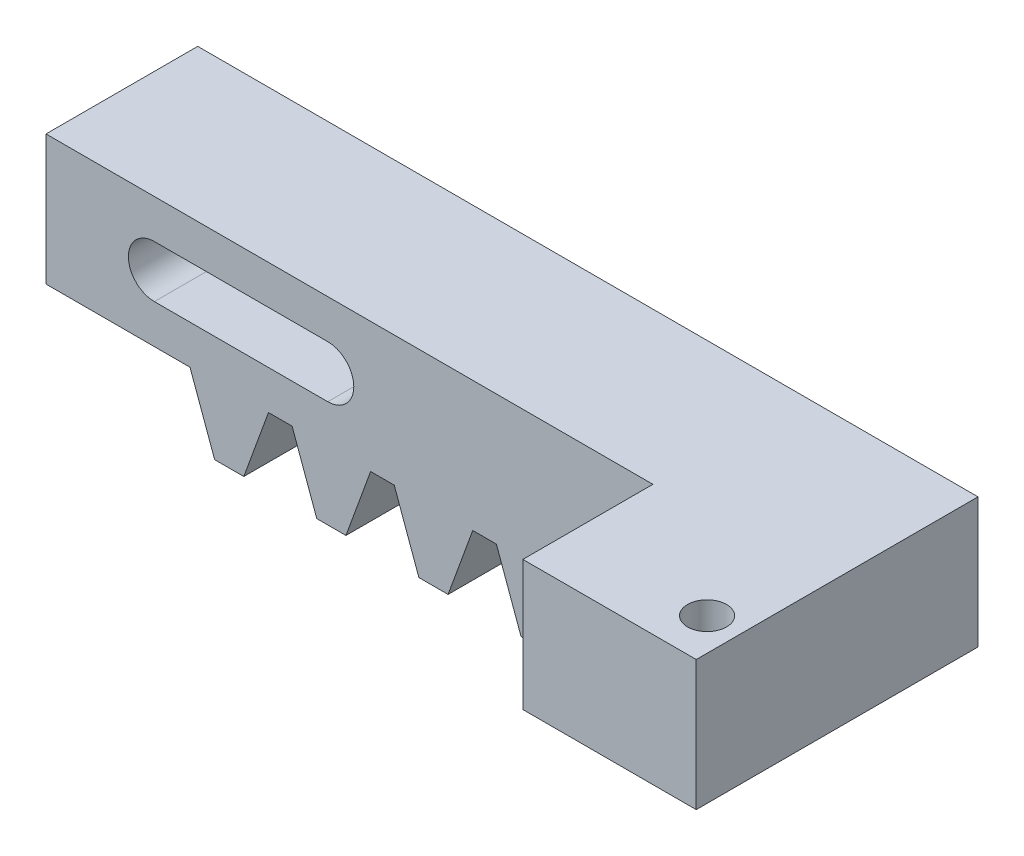
ISO-10303-21;
HEADER;
FILE_DESCRIPTION(('STEP AP214'),'2;1');
FILE_NAME('part.step','',(''),(''),'','','');
FILE_SCHEMA(('AUTOMOTIVE_DESIGN { 1 0 10303 214 1 1 1 1 }'));
ENDSEC;
DATA;
#1=APPLICATION_CONTEXT('core data for automotive mechanical design processes');
#2=APPLICATION_PROTOCOL_DEFINITION('international standard','automotive_design',2000,#1);
#3=PRODUCT_CONTEXT('',#1,'mechanical');
#4=PRODUCT('Part','Part','',(#3));
#5=PRODUCT_RELATED_PRODUCT_CATEGORY('part','',(#4));
#6=PRODUCT_DEFINITION_FORMATION('','',#4);
#7=PRODUCT_DEFINITION_CONTEXT('part definition',#1,'design');
#8=PRODUCT_DEFINITION('design','',#6,#7);
#9=PRODUCT_DEFINITION_SHAPE('','',#8);
#10=(LENGTH_UNIT() NAMED_UNIT(*) SI_UNIT(.MILLI.,.METRE.));
#11=(NAMED_UNIT(*) PLANE_ANGLE_UNIT() SI_UNIT($,.RADIAN.));
#12=(NAMED_UNIT(*) SI_UNIT($,.STERADIAN.) SOLID_ANGLE_UNIT());
#13=UNCERTAINTY_MEASURE_WITH_UNIT(LENGTH_MEASURE(1.E-05),#10,'distance_accuracy_value','');
#14=(GEOMETRIC_REPRESENTATION_CONTEXT(3) GLOBAL_UNCERTAINTY_ASSIGNED_CONTEXT((#13)) GLOBAL_UNIT_ASSIGNED_CONTEXT((#10,
#11,#12)) REPRESENTATION_CONTEXT('',''));
#15=CARTESIAN_POINT('',(0.,0.,0.));
#16=DIRECTION('',(0.,0.,1.));
#17=DIRECTION('',(1.,0.,0.));
#18=AXIS2_PLACEMENT_3D('',#15,#16,#17);
#19=CARTESIAN_POINT('',(0.,0.,20.5));
#20=DIRECTION('',(0.,0.,-1.));
#21=DIRECTION('',(-1.,0.,0.));
#22=AXIS2_PLACEMENT_3D('',#19,#20,#21);
#23=PLANE('',#22);
#24=CARTESIAN_POINT('',(-11.7,16.975,20.5));
#25=DIRECTION('',(0.,0.,-1.));
#26=DIRECTION('',(-1.,0.,0.));
#27=AXIS2_PLACEMENT_3D('',#24,#25,#26);
#28=CIRCLE('',#27,1.2);
#29=CARTESIAN_POINT('',(-11.7,18.175,20.5));
#30=VERTEX_POINT('',#29);
#31=CARTESIAN_POINT('',(-11.7,15.775,20.5));
#32=VERTEX_POINT('',#31);
#33=EDGE_CURVE('E507',#30,#32,#28,.F.);
#34=ORIENTED_EDGE('',*,*,#33,.F.);
#35=DIRECTION('',(-1.,0.,0.));
#36=VECTOR('',#35,1.);
#37=CARTESIAN_POINT('',(0.,18.175,20.5));
#38=LINE('',#37,#36);
#39=CARTESIAN_POINT('',(-3.7,18.175,20.5));
#40=VERTEX_POINT('',#39);
#41=EDGE_CURVE('E505',#40,#30,#38,.T.);
#42=ORIENTED_EDGE('',*,*,#41,.F.);
#43=CARTESIAN_POINT('',(-3.7,16.975,20.5));
#44=DIRECTION('',(0.,0.,-1.));
#45=DIRECTION('',(-1.,0.,0.));
#46=AXIS2_PLACEMENT_3D('',#43,#44,#45);
#47=CIRCLE('',#46,1.2);
#48=CARTESIAN_POINT('',(-3.7,15.775,20.5));
#49=VERTEX_POINT('',#48);
#50=EDGE_CURVE('E53',#49,#40,#47,.F.);
#51=ORIENTED_EDGE('',*,*,#50,.F.);
#52=DIRECTION('',(1.,0.,0.));
#53=VECTOR('',#52,1.);
#54=CARTESIAN_POINT('',(0.,15.775,20.5));
#55=LINE('',#54,#53);
#56=EDGE_CURVE('E497',#32,#49,#55,.T.);
#57=ORIENTED_EDGE('',*,*,#56,.F.);
#58=EDGE_LOOP('',(#34,#42,#51,#57));
#59=FACE_BOUND('',#58,.T.);
#60=DIRECTION('',(0.,-1.,0.));
#61=VECTOR('',#60,1.);
#62=CARTESIAN_POINT('',(11.3,19.975,20.5));
#63=LINE('',#62,#61);
#64=CARTESIAN_POINT('',(11.3,19.975,20.5));
#65=VERTEX_POINT('',#64);
#66=CARTESIAN_POINT('',(11.3,13.975,20.5));
#67=VERTEX_POINT('',#66);
#68=EDGE_CURVE('E481',#65,#67,#63,.T.);
#69=ORIENTED_EDGE('',*,*,#68,.F.);
#70=DIRECTION('',(-1.,0.,0.));
#71=VECTOR('',#70,1.);
#72=CARTESIAN_POINT('',(-16.7,19.975,20.5));
#73=LINE('',#72,#71);
#74=CARTESIAN_POINT('',(-16.7,19.975,20.5));
#75=VERTEX_POINT('',#74);
#76=EDGE_CURVE('E364',#65,#75,#73,.T.);
#77=ORIENTED_EDGE('',*,*,#76,.T.);
#78=DIRECTION('',(0.,-1.,0.));
#79=VECTOR('',#78,1.);
#80=CARTESIAN_POINT('',(-16.7,13.975,20.5));
#81=LINE('',#80,#79);
#82=CARTESIAN_POINT('',(-16.7,13.975,20.5));
#83=VERTEX_POINT('',#82);
#84=EDGE_CURVE('E370',#75,#83,#81,.T.);
#85=ORIENTED_EDGE('',*,*,#84,.T.);
#86=DIRECTION('',(1.,0.,0.));
#87=VECTOR('',#86,1.);
#88=CARTESIAN_POINT('',(-10.0572221500185,13.975,20.5));
#89=LINE('',#88,#87);
#90=CARTESIAN_POINT('',(-10.0572221500185,13.975,20.5));
#91=VERTEX_POINT('',#90);
#92=EDGE_CURVE('E469',#83,#91,#89,.T.);
#93=ORIENTED_EDGE('',*,*,#92,.T.);
#94=DIRECTION('',(0.342020143325669,-0.939692620785908,0.));
#95=VECTOR('',#94,1.);
#96=CARTESIAN_POINT('',(-8.91981516793663,10.85,20.5));
#97=LINE('',#96,#95);
#98=CARTESIAN_POINT('',(-8.91981516793663,10.85,20.5));
#99=VERTEX_POINT('',#98);
#100=EDGE_CURVE('E470',#91,#99,#97,.T.);
#101=ORIENTED_EDGE('',*,*,#100,.T.);
#102=DIRECTION('',(1.,0.,0.));
#103=VECTOR('',#102,1.);
#104=CARTESIAN_POINT('',(-7.57354626340979,10.85,20.5));
#105=LINE('',#104,#103);
#106=CARTESIAN_POINT('',(-7.57354626340979,10.85,20.5));
#107=VERTEX_POINT('',#106);
#108=EDGE_CURVE('E464',#99,#107,#105,.T.);
#109=ORIENTED_EDGE('',*,*,#108,.T.);
#110=DIRECTION('',(0.342020143325669,0.939692620785909,0.));
#111=VECTOR('',#110,1.);
#112=CARTESIAN_POINT('',(-6.43613928132791,13.975,20.5));
#113=LINE('',#112,#111);
#114=CARTESIAN_POINT('',(-6.43613928132791,13.975,20.5));
#115=VERTEX_POINT('',#114);
#116=EDGE_CURVE('E462',#107,#115,#113,.T.);
#117=ORIENTED_EDGE('',*,*,#116,.T.);
#118=DIRECTION('',(1.,0.,0.));
#119=VECTOR('',#118,1.);
#120=CARTESIAN_POINT('',(-5.34483316963382,13.975,20.5));
#121=LINE('',#120,#119);
#122=CARTESIAN_POINT('',(-5.34483316963382,13.975,20.5));
#123=VERTEX_POINT('',#122);
#124=EDGE_CURVE('E461',#115,#123,#121,.T.);
#125=ORIENTED_EDGE('',*,*,#124,.T.);
#126=DIRECTION('',(0.342020143325669,-0.939692620785909,0.));
#127=VECTOR('',#126,1.);
#128=CARTESIAN_POINT('',(-4.20742618755194,10.85,20.5));
#129=LINE('',#128,#127);
#130=CARTESIAN_POINT('',(-4.20742618755194,10.85,20.5));
#131=VERTEX_POINT('',#130);
#132=EDGE_CURVE('E460',#123,#131,#129,.T.);
#133=ORIENTED_EDGE('',*,*,#132,.T.);
#134=DIRECTION('',(1.,0.,0.));
#135=VECTOR('',#134,1.);
#136=CARTESIAN_POINT('',(-2.8611572830251,10.85,20.5));
#137=LINE('',#136,#135);
#138=CARTESIAN_POINT('',(-2.8611572830251,10.85,20.5));
#139=VERTEX_POINT('',#138);
#140=EDGE_CURVE('E459',#131,#139,#137,.T.);
#141=ORIENTED_EDGE('',*,*,#140,.T.);
#142=DIRECTION('',(0.342020143325669,0.939692620785909,0.));
#143=VECTOR('',#142,1.);
#144=CARTESIAN_POINT('',(-1.72375030094322,13.975,20.5));
#145=LINE('',#144,#143);
#146=CARTESIAN_POINT('',(-1.72375030094322,13.975,20.5));
#147=VERTEX_POINT('',#146);
#148=EDGE_CURVE('E455',#139,#147,#145,.T.);
#149=ORIENTED_EDGE('',*,*,#148,.T.);
#150=DIRECTION('',(1.,0.,0.));
#151=VECTOR('',#150,1.);
#152=CARTESIAN_POINT('',(-0.632444189249129,13.975,20.5));
#153=LINE('',#152,#151);
#154=CARTESIAN_POINT('',(-0.632444189249129,13.975,20.5));
#155=VERTEX_POINT('',#154);
#156=EDGE_CURVE('E454',#147,#155,#153,.T.);
#157=ORIENTED_EDGE('',*,*,#156,.T.);
#158=DIRECTION('',(0.342020143325669,-0.939692620785909,0.));
#159=VECTOR('',#158,1.);
#160=CARTESIAN_POINT('',(0.504962792832753,10.85,20.5));
#161=LINE('',#160,#159);
#162=CARTESIAN_POINT('',(0.504962792832753,10.85,20.5));
#163=VERTEX_POINT('',#162);
#164=EDGE_CURVE('E451',#155,#163,#161,.T.);
#165=ORIENTED_EDGE('',*,*,#164,.T.);
#166=DIRECTION('',(1.,0.,0.));
#167=VECTOR('',#166,1.);
#168=CARTESIAN_POINT('',(1.85123169735959,10.85,20.5));
#169=LINE('',#168,#167);
#170=CARTESIAN_POINT('',(1.85123169735959,10.85,20.5));
#171=VERTEX_POINT('',#170);
#172=EDGE_CURVE('E446',#163,#171,#169,.T.);
#173=ORIENTED_EDGE('',*,*,#172,.T.);
#174=DIRECTION('',(0.342020143325669,0.939692620785909,0.));
#175=VECTOR('',#174,1.);
#176=CARTESIAN_POINT('',(2.98863867944147,13.975,20.5));
#177=LINE('',#176,#175);
#178=CARTESIAN_POINT('',(2.98863867944147,13.975,20.5));
#179=VERTEX_POINT('',#178);
#180=EDGE_CURVE('E450',#171,#179,#177,.T.);
#181=ORIENTED_EDGE('',*,*,#180,.T.);
#182=DIRECTION('',(1.,0.,0.));
#183=VECTOR('',#182,1.);
#184=CARTESIAN_POINT('',(4.07994479113556,13.975,20.5));
#185=LINE('',#184,#183);
#186=CARTESIAN_POINT('',(4.07994479113556,13.975,20.5));
#187=VERTEX_POINT('',#186);
#188=EDGE_CURVE('E444',#179,#187,#185,.T.);
#189=ORIENTED_EDGE('',*,*,#188,.T.);
#190=DIRECTION('',(0.342020143325669,-0.939692620785909,0.));
#191=VECTOR('',#190,1.);
#192=CARTESIAN_POINT('',(5.21735177321744,10.85,20.5));
#193=LINE('',#192,#191);
#194=CARTESIAN_POINT('',(5.21735177321744,10.85,20.5));
#195=VERTEX_POINT('',#194);
#196=EDGE_CURVE('E442',#187,#195,#193,.T.);
#197=ORIENTED_EDGE('',*,*,#196,.T.);
#198=DIRECTION('',(1.,0.,0.));
#199=VECTOR('',#198,1.);
#200=CARTESIAN_POINT('',(6.56362067774428,10.85,20.5));
#201=LINE('',#200,#199);
#202=CARTESIAN_POINT('',(6.56362067774428,10.85,20.5));
#203=VERTEX_POINT('',#202);
#204=EDGE_CURVE('E441',#195,#203,#201,.T.);
#205=ORIENTED_EDGE('',*,*,#204,.T.);
#206=DIRECTION('',(0.342020143325669,0.939692620785909,0.));
#207=VECTOR('',#206,1.);
#208=CARTESIAN_POINT('',(7.70102765982616,13.975,20.5));
#209=LINE('',#208,#207);
#210=CARTESIAN_POINT('',(7.70102765982616,13.975,20.5));
#211=VERTEX_POINT('',#210);
#212=EDGE_CURVE('E437',#203,#211,#209,.T.);
#213=ORIENTED_EDGE('',*,*,#212,.T.);
#214=DIRECTION('',(1.,0.,0.));
#215=VECTOR('',#214,1.);
#216=CARTESIAN_POINT('',(8.79233377152025,13.975,20.5));
#217=LINE('',#216,#215);
#218=CARTESIAN_POINT('',(8.79233377152025,13.975,20.5));
#219=VERTEX_POINT('',#218);
#220=EDGE_CURVE('E440',#211,#219,#217,.T.);
#221=ORIENTED_EDGE('',*,*,#220,.T.);
#222=DIRECTION('',(0.342020143325669,-0.939692620785908,0.));
#223=VECTOR('',#222,1.);
#224=CARTESIAN_POINT('',(9.92974075360213,10.85,20.5));
#225=LINE('',#224,#223);
#226=CARTESIAN_POINT('',(9.92974075360213,10.85,20.5));
#227=VERTEX_POINT('',#226);
#228=EDGE_CURVE('E434',#219,#227,#225,.T.);
#229=ORIENTED_EDGE('',*,*,#228,.T.);
#230=DIRECTION('',(1.,0.,0.));
#231=VECTOR('',#230,1.);
#232=CARTESIAN_POINT('',(11.276009658129,10.85,20.5));
#233=LINE('',#232,#231);
#234=CARTESIAN_POINT('',(11.276009658129,10.85,20.5));
#235=VERTEX_POINT('',#234);
#236=EDGE_CURVE('E433',#227,#235,#233,.T.);
#237=ORIENTED_EDGE('',*,*,#236,.T.);
#238=DIRECTION('',(0.342020143325669,0.939692620785908,0.));
#239=VECTOR('',#238,1.);
#240=CARTESIAN_POINT('',(12.4134166402109,13.975,20.5));
#241=LINE('',#240,#239);
#242=CARTESIAN_POINT('',(12.4134166402109,13.975,20.5));
#243=VERTEX_POINT('',#242);
#244=EDGE_CURVE('E431',#235,#243,#241,.T.);
#245=ORIENTED_EDGE('',*,*,#244,.T.);
#246=DIRECTION('',(1.,0.,0.));
#247=VECTOR('',#246,1.);
#248=CARTESIAN_POINT('',(11.3,13.975,20.5));
#249=LINE('',#248,#247);
#250=EDGE_CURVE('E278',#67,#243,#249,.T.);
#251=ORIENTED_EDGE('',*,*,#250,.F.);
#252=EDGE_LOOP('',(#69,#77,#85,#93,#101,#109,#117,#125,#133,#141,#149,#157,#165,#173,#181,#189,
#197,#205,#213,#221,#229,#237,#245,#251));
#253=FACE_BOUND('',#252,.T.);
#254=ADVANCED_FACE('F39',(#59,#253),#23,.F.);
#255=CARTESIAN_POINT('',(0.,0.,13.5));
#256=DIRECTION('',(0.,0.,-1.));
#257=DIRECTION('',(-1.,0.,0.));
#258=AXIS2_PLACEMENT_3D('',#255,#256,#257);
#259=PLANE('',#258);
#260=DIRECTION('',(0.,-1.,0.));
#261=VECTOR('',#260,1.);
#262=CARTESIAN_POINT('',(-16.7,13.975,13.5));
#263=LINE('',#262,#261);
#264=CARTESIAN_POINT('',(-16.7,19.975,13.5));
#265=VERTEX_POINT('',#264);
#266=CARTESIAN_POINT('',(-16.7,13.975,13.5));
#267=VERTEX_POINT('',#266);
#268=EDGE_CURVE('E419',#265,#267,#263,.T.);
#269=ORIENTED_EDGE('',*,*,#268,.F.);
#270=DIRECTION('',(-1.,0.,0.));
#271=VECTOR('',#270,1.);
#272=CARTESIAN_POINT('',(-16.7,19.975,13.5));
#273=LINE('',#272,#271);
#274=CARTESIAN_POINT('',(19.3,19.975,13.5));
#275=VERTEX_POINT('',#274);
#276=EDGE_CURVE('E362',#275,#265,#273,.T.);
#277=ORIENTED_EDGE('',*,*,#276,.F.);
#278=DIRECTION('',(0.,1.,0.));
#279=VECTOR('',#278,1.);
#280=CARTESIAN_POINT('',(19.3,19.975,13.5));
#281=LINE('',#280,#279);
#282=CARTESIAN_POINT('',(19.3,13.975,13.5));
#283=VERTEX_POINT('',#282);
#284=EDGE_CURVE('E368',#283,#275,#281,.T.);
#285=ORIENTED_EDGE('',*,*,#284,.F.);
#286=DIRECTION('',(1.,0.,0.));
#287=VECTOR('',#286,1.);
#288=CARTESIAN_POINT('',(19.3,13.975,13.5));
#289=LINE('',#288,#287);
#290=CARTESIAN_POINT('',(17.1258056205955,13.975,13.5));
#291=VERTEX_POINT('',#290);
#292=EDGE_CURVE('E369',#291,#283,#289,.T.);
#293=ORIENTED_EDGE('',*,*,#292,.F.);
#294=DIRECTION('',(0.34202014332567,0.939692620785908,0.));
#295=VECTOR('',#294,1.);
#296=CARTESIAN_POINT('',(17.1258056205955,13.975,13.5));
#297=LINE('',#296,#295);
#298=CARTESIAN_POINT('',(15.9883986385137,10.85,13.5));
#299=VERTEX_POINT('',#298);
#300=EDGE_CURVE('E375',#299,#291,#297,.T.);
#301=ORIENTED_EDGE('',*,*,#300,.F.);
#302=DIRECTION('',(1.,0.,0.));
#303=VECTOR('',#302,1.);
#304=CARTESIAN_POINT('',(15.9883986385137,10.85,13.5));
#305=LINE('',#304,#303);
#306=CARTESIAN_POINT('',(14.6421297339868,10.85,13.5));
#307=VERTEX_POINT('',#306);
#308=EDGE_CURVE('E372',#307,#299,#305,.T.);
#309=ORIENTED_EDGE('',*,*,#308,.F.);
#310=DIRECTION('',(0.342020143325669,-0.939692620785908,0.));
#311=VECTOR('',#310,1.);
#312=CARTESIAN_POINT('',(14.6421297339868,10.85,13.5));
#313=LINE('',#312,#311);
#314=CARTESIAN_POINT('',(13.5047227519049,13.975,13.5));
#315=VERTEX_POINT('',#314);
#316=EDGE_CURVE('E376',#315,#307,#313,.T.);
#317=ORIENTED_EDGE('',*,*,#316,.F.);
#318=DIRECTION('',(1.,0.,0.));
#319=VECTOR('',#318,1.);
#320=CARTESIAN_POINT('',(13.5047227519049,13.975,13.5));
#321=LINE('',#320,#319);
#322=CARTESIAN_POINT('',(12.4134166402109,13.975,13.5));
#323=VERTEX_POINT('',#322);
#324=EDGE_CURVE('E377',#323,#315,#321,.T.);
#325=ORIENTED_EDGE('',*,*,#324,.F.);
#326=DIRECTION('',(0.342020143325669,0.939692620785908,0.));
#327=VECTOR('',#326,1.);
#328=CARTESIAN_POINT('',(12.4134166402109,13.975,13.5));
#329=LINE('',#328,#327);
#330=CARTESIAN_POINT('',(11.276009658129,10.85,13.5));
#331=VERTEX_POINT('',#330);
#332=EDGE_CURVE('E379',#331,#323,#329,.T.);
#333=ORIENTED_EDGE('',*,*,#332,.F.);
#334=DIRECTION('',(1.,0.,0.));
#335=VECTOR('',#334,1.);
#336=CARTESIAN_POINT('',(11.276009658129,10.85,13.5));
#337=LINE('',#336,#335);
#338=CARTESIAN_POINT('',(9.92974075360213,10.85,13.5));
#339=VERTEX_POINT('',#338);
#340=EDGE_CURVE('E385',#339,#331,#337,.T.);
#341=ORIENTED_EDGE('',*,*,#340,.F.);
#342=DIRECTION('',(0.342020143325669,-0.939692620785908,0.));
#343=VECTOR('',#342,1.);
#344=CARTESIAN_POINT('',(9.92974075360213,10.85,13.5));
#345=LINE('',#344,#343);
#346=CARTESIAN_POINT('',(8.79233377152025,13.975,13.5));
#347=VERTEX_POINT('',#346);
#348=EDGE_CURVE('E381',#347,#339,#345,.T.);
#349=ORIENTED_EDGE('',*,*,#348,.F.);
#350=DIRECTION('',(1.,0.,0.));
#351=VECTOR('',#350,1.);
#352=CARTESIAN_POINT('',(8.79233377152025,13.975,13.5));
#353=LINE('',#352,#351);
#354=CARTESIAN_POINT('',(7.70102765982616,13.975,13.5));
#355=VERTEX_POINT('',#354);
#356=EDGE_CURVE('E386',#355,#347,#353,.T.);
#357=ORIENTED_EDGE('',*,*,#356,.F.);
#358=DIRECTION('',(0.342020143325669,0.939692620785909,0.));
#359=VECTOR('',#358,1.);
#360=CARTESIAN_POINT('',(7.70102765982616,13.975,13.5));
#361=LINE('',#360,#359);
#362=CARTESIAN_POINT('',(6.56362067774428,10.85,13.5));
#363=VERTEX_POINT('',#362);
#364=EDGE_CURVE('E389',#363,#355,#361,.T.);
#365=ORIENTED_EDGE('',*,*,#364,.F.);
#366=DIRECTION('',(1.,0.,0.));
#367=VECTOR('',#366,1.);
#368=CARTESIAN_POINT('',(6.56362067774428,10.85,13.5));
#369=LINE('',#368,#367);
#370=CARTESIAN_POINT('',(5.21735177321744,10.85,13.5));
#371=VERTEX_POINT('',#370);
#372=EDGE_CURVE('E390',#371,#363,#369,.T.);
#373=ORIENTED_EDGE('',*,*,#372,.F.);
#374=DIRECTION('',(0.342020143325669,-0.939692620785909,0.));
#375=VECTOR('',#374,1.);
#376=CARTESIAN_POINT('',(5.21735177321744,10.85,13.5));
#377=LINE('',#376,#375);
#378=CARTESIAN_POINT('',(4.07994479113556,13.975,13.5));
#379=VERTEX_POINT('',#378);
#380=EDGE_CURVE('E394',#379,#371,#377,.T.);
#381=ORIENTED_EDGE('',*,*,#380,.F.);
#382=DIRECTION('',(1.,0.,0.));
#383=VECTOR('',#382,1.);
#384=CARTESIAN_POINT('',(4.07994479113556,13.975,13.5));
#385=LINE('',#384,#383);
#386=CARTESIAN_POINT('',(2.98863867944147,13.975,13.5));
#387=VERTEX_POINT('',#386);
#388=EDGE_CURVE('E395',#387,#379,#385,.T.);
#389=ORIENTED_EDGE('',*,*,#388,.F.);
#390=DIRECTION('',(0.342020143325669,0.939692620785909,0.));
#391=VECTOR('',#390,1.);
#392=CARTESIAN_POINT('',(2.98863867944147,13.975,13.5));
#393=LINE('',#392,#391);
#394=CARTESIAN_POINT('',(1.85123169735959,10.85,13.5));
#395=VERTEX_POINT('',#394);
#396=EDGE_CURVE('E396',#395,#387,#393,.T.);
#397=ORIENTED_EDGE('',*,*,#396,.F.);
#398=DIRECTION('',(1.,0.,0.));
#399=VECTOR('',#398,1.);
#400=CARTESIAN_POINT('',(1.85123169735959,10.85,13.5));
#401=LINE('',#400,#399);
#402=CARTESIAN_POINT('',(0.504962792832753,10.85,13.5));
#403=VERTEX_POINT('',#402);
#404=EDGE_CURVE('E397',#403,#395,#401,.T.);
#405=ORIENTED_EDGE('',*,*,#404,.F.);
#406=DIRECTION('',(0.342020143325669,-0.939692620785909,0.));
#407=VECTOR('',#406,1.);
#408=CARTESIAN_POINT('',(0.504962792832753,10.85,13.5));
#409=LINE('',#408,#407);
#410=CARTESIAN_POINT('',(-0.632444189249129,13.975,13.5));
#411=VERTEX_POINT('',#410);
#412=EDGE_CURVE('E399',#411,#403,#409,.T.);
#413=ORIENTED_EDGE('',*,*,#412,.F.);
#414=DIRECTION('',(1.,0.,0.));
#415=VECTOR('',#414,1.);
#416=CARTESIAN_POINT('',(-0.632444189249129,13.975,13.5));
#417=LINE('',#416,#415);
#418=CARTESIAN_POINT('',(-1.72375030094322,13.975,13.5));
#419=VERTEX_POINT('',#418);
#420=EDGE_CURVE('E405',#419,#411,#417,.T.);
#421=ORIENTED_EDGE('',*,*,#420,.F.);
#422=DIRECTION('',(0.342020143325669,0.939692620785909,0.));
#423=VECTOR('',#422,1.);
#424=CARTESIAN_POINT('',(-1.72375030094322,13.975,13.5));
#425=LINE('',#424,#423);
#426=CARTESIAN_POINT('',(-2.8611572830251,10.85,13.5));
#427=VERTEX_POINT('',#426);
#428=EDGE_CURVE('E404',#427,#419,#425,.T.);
#429=ORIENTED_EDGE('',*,*,#428,.F.);
#430=DIRECTION('',(1.,0.,0.));
#431=VECTOR('',#430,1.);
#432=CARTESIAN_POINT('',(-2.8611572830251,10.85,13.5));
#433=LINE('',#432,#431);
#434=CARTESIAN_POINT('',(-4.20742618755194,10.85,13.5));
#435=VERTEX_POINT('',#434);
#436=EDGE_CURVE('E406',#435,#427,#433,.T.);
#437=ORIENTED_EDGE('',*,*,#436,.F.);
#438=DIRECTION('',(0.342020143325669,-0.939692620785909,0.));
#439=VECTOR('',#438,1.);
#440=CARTESIAN_POINT('',(-4.20742618755194,10.85,13.5));
#441=LINE('',#440,#439);
#442=CARTESIAN_POINT('',(-5.34483316963382,13.975,13.5));
#443=VERTEX_POINT('',#442);
#444=EDGE_CURVE('E409',#443,#435,#441,.T.);
#445=ORIENTED_EDGE('',*,*,#444,.F.);
#446=DIRECTION('',(1.,0.,0.));
#447=VECTOR('',#446,1.);
#448=CARTESIAN_POINT('',(-5.34483316963382,13.975,13.5));
#449=LINE('',#448,#447);
#450=CARTESIAN_POINT('',(-6.43613928132791,13.975,13.5));
#451=VERTEX_POINT('',#450);
#452=EDGE_CURVE('E410',#451,#443,#449,.T.);
#453=ORIENTED_EDGE('',*,*,#452,.F.);
#454=DIRECTION('',(0.342020143325669,0.939692620785909,0.));
#455=VECTOR('',#454,1.);
#456=CARTESIAN_POINT('',(-6.43613928132791,13.975,13.5));
#457=LINE('',#456,#455);
#458=CARTESIAN_POINT('',(-7.57354626340979,10.85,13.5));
#459=VERTEX_POINT('',#458);
#460=EDGE_CURVE('E414',#459,#451,#457,.T.);
#461=ORIENTED_EDGE('',*,*,#460,.F.);
#462=DIRECTION('',(1.,0.,0.));
#463=VECTOR('',#462,1.);
#464=CARTESIAN_POINT('',(-7.57354626340979,10.85,13.5));
#465=LINE('',#464,#463);
#466=CARTESIAN_POINT('',(-8.91981516793663,10.85,13.5));
#467=VERTEX_POINT('',#466);
#468=EDGE_CURVE('E415',#467,#459,#465,.T.);
#469=ORIENTED_EDGE('',*,*,#468,.F.);
#470=DIRECTION('',(0.342020143325669,-0.939692620785908,0.));
#471=VECTOR('',#470,1.);
#472=CARTESIAN_POINT('',(-8.91981516793663,10.85,13.5));
#473=LINE('',#472,#471);
#474=CARTESIAN_POINT('',(-10.0572221500185,13.975,13.5));
#475=VERTEX_POINT('',#474);
#476=EDGE_CURVE('E416',#475,#467,#473,.T.);
#477=ORIENTED_EDGE('',*,*,#476,.F.);
#478=DIRECTION('',(1.,0.,0.));
#479=VECTOR('',#478,1.);
#480=CARTESIAN_POINT('',(-10.0572221500185,13.975,13.5));
#481=LINE('',#480,#479);
#482=EDGE_CURVE('E417',#267,#475,#481,.T.);
#483=ORIENTED_EDGE('',*,*,#482,.F.);
#484=EDGE_LOOP('',(#269,#277,#285,#293,#301,#309,#317,#325,#333,#341,#349,#357,#365,#373,#381,
#389,#397,#405,#413,#421,#429,#437,#445,#453,#461,#469,#477,#483));
#485=FACE_BOUND('',#484,.T.);
#486=DIRECTION('',(-1.,0.,0.));
#487=VECTOR('',#486,1.);
#488=CARTESIAN_POINT('',(0.,18.175,13.5));
#489=LINE('',#488,#487);
#490=CARTESIAN_POINT('',(-3.7,18.175,13.5));
#491=VERTEX_POINT('',#490);
#492=CARTESIAN_POINT('',(-11.7,18.175,13.5));
#493=VERTEX_POINT('',#492);
#494=EDGE_CURVE('E50',#491,#493,#489,.T.);
#495=ORIENTED_EDGE('',*,*,#494,.T.);
#496=CARTESIAN_POINT('',(-11.7,16.975,13.5));
#497=DIRECTION('',(0.,0.,-1.));
#498=DIRECTION('',(-1.,0.,0.));
#499=AXIS2_PLACEMENT_3D('',#496,#497,#498);
#500=CIRCLE('',#499,1.2);
#501=CARTESIAN_POINT('',(-11.7,15.775,13.5));
#502=VERTEX_POINT('',#501);
#503=EDGE_CURVE('E62',#493,#502,#500,.F.);
#504=ORIENTED_EDGE('',*,*,#503,.T.);
#505=DIRECTION('',(1.,0.,0.));
#506=VECTOR('',#505,1.);
#507=CARTESIAN_POINT('',(0.,15.775,13.5));
#508=LINE('',#507,#506);
#509=CARTESIAN_POINT('',(-3.7,15.775,13.5));
#510=VERTEX_POINT('',#509);
#511=EDGE_CURVE('E11',#502,#510,#508,.T.);
#512=ORIENTED_EDGE('',*,*,#511,.T.);
#513=CARTESIAN_POINT('',(-3.7,16.975,13.5));
#514=DIRECTION('',(0.,0.,-1.));
#515=DIRECTION('',(-1.,0.,0.));
#516=AXIS2_PLACEMENT_3D('',#513,#514,#515);
#517=CIRCLE('',#516,1.2);
#518=EDGE_CURVE('E260',#510,#491,#517,.F.);
#519=ORIENTED_EDGE('',*,*,#518,.T.);
#520=EDGE_LOOP('',(#495,#504,#512,#519));
#521=FACE_BOUND('',#520,.T.);
#522=ADVANCED_FACE('F272',(#485,#521),#259,.T.);
#523=CARTESIAN_POINT('',(13.5047227519049,13.975,20.5));
#524=VERTEX_POINT('',#523);
#525=CARTESIAN_POINT('',(17.1258056205955,13.975,20.5));
#526=VERTEX_POINT('',#525);
#527=EDGE_CURVE('E273',#524,#526,#249,.T.);
#528=ORIENTED_EDGE('',*,*,#527,.F.);
#529=DIRECTION('',(0.342020143325669,-0.939692620785908,0.));
#530=VECTOR('',#529,1.);
#531=CARTESIAN_POINT('',(14.6421297339868,10.85,20.5));
#532=LINE('',#531,#530);
#533=CARTESIAN_POINT('',(14.6421297339868,10.85,20.5));
#534=VERTEX_POINT('',#533);
#535=EDGE_CURVE('E429',#524,#534,#532,.T.);
#536=ORIENTED_EDGE('',*,*,#535,.T.);
#537=DIRECTION('',(1.,0.,0.));
#538=VECTOR('',#537,1.);
#539=CARTESIAN_POINT('',(15.9883986385137,10.85,20.5));
#540=LINE('',#539,#538);
#541=CARTESIAN_POINT('',(15.9883986385137,10.85,20.5));
#542=VERTEX_POINT('',#541);
#543=EDGE_CURVE('E430',#534,#542,#540,.T.);
#544=ORIENTED_EDGE('',*,*,#543,.T.);
#545=DIRECTION('',(0.34202014332567,0.939692620785908,0.));
#546=VECTOR('',#545,1.);
#547=CARTESIAN_POINT('',(17.1258056205955,13.975,20.5));
#548=LINE('',#547,#546);
#549=EDGE_CURVE('E424',#542,#526,#548,.T.);
#550=ORIENTED_EDGE('',*,*,#549,.T.);
#551=EDGE_LOOP('',(#528,#536,#544,#550));
#552=FACE_BOUND('',#551,.T.);
#553=ADVANCED_FACE('F530',(#552),#23,.F.);
#554=CARTESIAN_POINT('',(-16.7,13.975,20.5));
#555=DIRECTION('',(1.,0.,0.));
#556=DIRECTION('',(0.,0.,-1.));
#557=AXIS2_PLACEMENT_3D('',#554,#555,#556);
#558=PLANE('',#557);
#559=ORIENTED_EDGE('',*,*,#268,.T.);
#560=DIRECTION('',(0.,0.,-1.));
#561=VECTOR('',#560,1.);
#562=CARTESIAN_POINT('',(-16.7,13.975,20.5));
#563=LINE('',#562,#561);
#564=EDGE_CURVE('E277',#83,#267,#563,.T.);
#565=ORIENTED_EDGE('',*,*,#564,.F.);
#566=ORIENTED_EDGE('',*,*,#84,.F.);
#567=DIRECTION('',(0.,0.,-1.));
#568=VECTOR('',#567,1.);
#569=CARTESIAN_POINT('',(-16.7,19.975,20.5));
#570=LINE('',#569,#568);
#571=EDGE_CURVE('E363',#75,#265,#570,.T.);
#572=ORIENTED_EDGE('',*,*,#571,.T.);
#573=EDGE_LOOP('',(#559,#565,#566,#572));
#574=FACE_BOUND('',#573,.T.);
#575=ADVANCED_FACE('F41',(#574),#558,.F.);
#576=CARTESIAN_POINT('',(-10.0572221500185,13.975,20.5));
#577=DIRECTION('',(0.,1.,0.));
#578=DIRECTION('',(0.,0.,1.));
#579=AXIS2_PLACEMENT_3D('',#576,#577,#578);
#580=PLANE('',#579);
#581=ORIENTED_EDGE('',*,*,#482,.T.);
#582=DIRECTION('',(0.,0.,-1.));
#583=VECTOR('',#582,1.);
#584=CARTESIAN_POINT('',(-10.0572221500185,13.975,20.5));
#585=LINE('',#584,#583);
#586=EDGE_CURVE('E282',#91,#475,#585,.T.);
#587=ORIENTED_EDGE('',*,*,#586,.F.);
#588=ORIENTED_EDGE('',*,*,#92,.F.);
#589=ORIENTED_EDGE('',*,*,#564,.T.);
#590=EDGE_LOOP('',(#581,#587,#588,#589));
#591=FACE_BOUND('',#590,.T.);
#592=ADVANCED_FACE('F544',(#591),#580,.F.);
#593=CARTESIAN_POINT('',(-8.91981516793663,10.85,20.5));
#594=DIRECTION('',(0.939692620785908,0.342020143325669,0.));
#595=DIRECTION('',(-0.342020143325669,0.939692620785908,0.));
#596=AXIS2_PLACEMENT_3D('',#593,#594,#595);
#597=PLANE('',#596);
#598=ORIENTED_EDGE('',*,*,#476,.T.);
#599=DIRECTION('',(0.,0.,-1.));
#600=VECTOR('',#599,1.);
#601=CARTESIAN_POINT('',(-8.91981516793663,10.85,20.5));
#602=LINE('',#601,#600);
#603=EDGE_CURVE('E286',#99,#467,#602,.T.);
#604=ORIENTED_EDGE('',*,*,#603,.F.);
#605=ORIENTED_EDGE('',*,*,#100,.F.);
#606=ORIENTED_EDGE('',*,*,#586,.T.);
#607=EDGE_LOOP('',(#598,#604,#605,#606));
#608=FACE_BOUND('',#607,.T.);
#609=ADVANCED_FACE('F586',(#608),#597,.F.);
#610=CARTESIAN_POINT('',(-7.57354626340979,10.85,20.5));
#611=DIRECTION('',(0.,1.,0.));
#612=DIRECTION('',(0.,0.,1.));
#613=AXIS2_PLACEMENT_3D('',#610,#611,#612);
#614=PLANE('',#613);
#615=ORIENTED_EDGE('',*,*,#468,.T.);
#616=DIRECTION('',(0.,0.,-1.));
#617=VECTOR('',#616,1.);
#618=CARTESIAN_POINT('',(-7.57354626340979,10.85,20.5));
#619=LINE('',#618,#617);
#620=EDGE_CURVE('E288',#107,#459,#619,.T.);
#621=ORIENTED_EDGE('',*,*,#620,.F.);
#622=ORIENTED_EDGE('',*,*,#108,.F.);
#623=ORIENTED_EDGE('',*,*,#603,.T.);
#624=EDGE_LOOP('',(#615,#621,#622,#623));
#625=FACE_BOUND('',#624,.T.);
#626=ADVANCED_FACE('F594',(#625),#614,.F.);
#627=CARTESIAN_POINT('',(-6.43613928132791,13.975,20.5));
#628=DIRECTION('',(-0.939692620785908,0.342020143325669,0.));
#629=DIRECTION('',(-0.342020143325669,-0.939692620785909,0.));
#630=AXIS2_PLACEMENT_3D('',#627,#628,#629);
#631=PLANE('',#630);
#632=ORIENTED_EDGE('',*,*,#460,.T.);
#633=DIRECTION('',(0.,0.,-1.));
#634=VECTOR('',#633,1.);
#635=CARTESIAN_POINT('',(-6.43613928132791,13.975,20.5));
#636=LINE('',#635,#634);
#637=EDGE_CURVE('E292',#115,#451,#636,.T.);
#638=ORIENTED_EDGE('',*,*,#637,.F.);
#639=ORIENTED_EDGE('',*,*,#116,.F.);
#640=ORIENTED_EDGE('',*,*,#620,.T.);
#641=EDGE_LOOP('',(#632,#638,#639,#640));
#642=FACE_BOUND('',#641,.T.);
#643=ADVANCED_FACE('F601',(#642),#631,.F.);
#644=CARTESIAN_POINT('',(-5.34483316963382,13.975,20.5));
#645=DIRECTION('',(0.,1.,0.));
#646=DIRECTION('',(0.,0.,1.));
#647=AXIS2_PLACEMENT_3D('',#644,#645,#646);
#648=PLANE('',#647);
#649=ORIENTED_EDGE('',*,*,#452,.T.);
#650=DIRECTION('',(0.,0.,-1.));
#651=VECTOR('',#650,1.);
#652=CARTESIAN_POINT('',(-5.34483316963382,13.975,20.5));
#653=LINE('',#652,#651);
#654=EDGE_CURVE('E294',#123,#443,#653,.T.);
#655=ORIENTED_EDGE('',*,*,#654,.F.);
#656=ORIENTED_EDGE('',*,*,#124,.F.);
#657=ORIENTED_EDGE('',*,*,#637,.T.);
#658=EDGE_LOOP('',(#649,#655,#656,#657));
#659=FACE_BOUND('',#658,.T.);
#660=ADVANCED_FACE('F605',(#659),#648,.F.);
#661=CARTESIAN_POINT('',(-4.20742618755194,10.85,20.5));
#662=DIRECTION('',(0.939692620785908,0.342020143325669,0.));
#663=DIRECTION('',(-0.342020143325669,0.939692620785908,0.));
#664=AXIS2_PLACEMENT_3D('',#661,#662,#663);
#665=PLANE('',#664);
#666=ORIENTED_EDGE('',*,*,#444,.T.);
#667=DIRECTION('',(0.,0.,-1.));
#668=VECTOR('',#667,1.);
#669=CARTESIAN_POINT('',(-4.20742618755194,10.85,20.5));
#670=LINE('',#669,#668);
#671=EDGE_CURVE('E296',#131,#435,#670,.T.);
#672=ORIENTED_EDGE('',*,*,#671,.F.);
#673=ORIENTED_EDGE('',*,*,#132,.F.);
#674=ORIENTED_EDGE('',*,*,#654,.T.);
#675=EDGE_LOOP('',(#666,#672,#673,#674));
#676=FACE_BOUND('',#675,.T.);
#677=ADVANCED_FACE('F606',(#676),#665,.F.);
#678=CARTESIAN_POINT('',(-2.8611572830251,10.85,20.5));
#679=DIRECTION('',(0.,1.,0.));
#680=DIRECTION('',(0.,0.,1.));
#681=AXIS2_PLACEMENT_3D('',#678,#679,#680);
#682=PLANE('',#681);
#683=ORIENTED_EDGE('',*,*,#436,.T.);
#684=DIRECTION('',(0.,0.,-1.));
#685=VECTOR('',#684,1.);
#686=CARTESIAN_POINT('',(-2.8611572830251,10.85,20.5));
#687=LINE('',#686,#685);
#688=EDGE_CURVE('E301',#139,#427,#687,.T.);
#689=ORIENTED_EDGE('',*,*,#688,.F.);
#690=ORIENTED_EDGE('',*,*,#140,.F.);
#691=ORIENTED_EDGE('',*,*,#671,.T.);
#692=EDGE_LOOP('',(#683,#689,#690,#691));
#693=FACE_BOUND('',#692,.T.);
#694=ADVANCED_FACE('F618',(#693),#682,.F.);
#695=CARTESIAN_POINT('',(-1.72375030094322,13.975,20.5));
#696=DIRECTION('',(-0.939692620785908,0.342020143325669,0.));
#697=DIRECTION('',(-0.342020143325669,-0.939692620785908,0.));
#698=AXIS2_PLACEMENT_3D('',#695,#696,#697);
#699=PLANE('',#698);
#700=ORIENTED_EDGE('',*,*,#428,.T.);
#701=DIRECTION('',(0.,0.,-1.));
#702=VECTOR('',#701,1.);
#703=CARTESIAN_POINT('',(-1.72375030094322,13.975,20.5));
#704=LINE('',#703,#702);
#705=EDGE_CURVE('E302',#147,#419,#704,.T.);
#706=ORIENTED_EDGE('',*,*,#705,.F.);
#707=ORIENTED_EDGE('',*,*,#148,.F.);
#708=ORIENTED_EDGE('',*,*,#688,.T.);
#709=EDGE_LOOP('',(#700,#706,#707,#708));
#710=FACE_BOUND('',#709,.T.);
#711=ADVANCED_FACE('F619',(#710),#699,.F.);
#712=CARTESIAN_POINT('',(-0.632444189249129,13.975,20.5));
#713=DIRECTION('',(0.,1.,0.));
#714=DIRECTION('',(0.,0.,1.));
#715=AXIS2_PLACEMENT_3D('',#712,#713,#714);
#716=PLANE('',#715);
#717=ORIENTED_EDGE('',*,*,#420,.T.);
#718=DIRECTION('',(0.,0.,-1.));
#719=VECTOR('',#718,1.);
#720=CARTESIAN_POINT('',(-0.632444189249129,13.975,20.5));
#721=LINE('',#720,#719);
#722=EDGE_CURVE('E310',#155,#411,#721,.T.);
#723=ORIENTED_EDGE('',*,*,#722,.F.);
#724=ORIENTED_EDGE('',*,*,#156,.F.);
#725=ORIENTED_EDGE('',*,*,#705,.T.);
#726=EDGE_LOOP('',(#717,#723,#724,#725));
#727=FACE_BOUND('',#726,.T.);
#728=ADVANCED_FACE('F622',(#727),#716,.F.);
#729=CARTESIAN_POINT('',(0.504962792832753,10.85,20.5));
#730=DIRECTION('',(0.939692620785908,0.342020143325669,0.));
#731=DIRECTION('',(-0.342020143325669,0.939692620785908,0.));
#732=AXIS2_PLACEMENT_3D('',#729,#730,#731);
#733=PLANE('',#732);
#734=ORIENTED_EDGE('',*,*,#412,.T.);
#735=DIRECTION('',(0.,0.,-1.));
#736=VECTOR('',#735,1.);
#737=CARTESIAN_POINT('',(0.504962792832753,10.85,20.5));
#738=LINE('',#737,#736);
#739=EDGE_CURVE('E309',#163,#403,#738,.T.);
#740=ORIENTED_EDGE('',*,*,#739,.F.);
#741=ORIENTED_EDGE('',*,*,#164,.F.);
#742=ORIENTED_EDGE('',*,*,#722,.T.);
#743=EDGE_LOOP('',(#734,#740,#741,#742));
#744=FACE_BOUND('',#743,.T.);
#745=ADVANCED_FACE('F631',(#744),#733,.F.);
#746=CARTESIAN_POINT('',(1.85123169735959,10.85,20.5));
#747=DIRECTION('',(0.,1.,0.));
#748=DIRECTION('',(0.,0.,1.));
#749=AXIS2_PLACEMENT_3D('',#746,#747,#748);
#750=PLANE('',#749);
#751=ORIENTED_EDGE('',*,*,#404,.T.);
#752=DIRECTION('',(0.,0.,-1.));
#753=VECTOR('',#752,1.);
#754=CARTESIAN_POINT('',(1.85123169735959,10.85,20.5));
#755=LINE('',#754,#753);
#756=EDGE_CURVE('E312',#171,#395,#755,.T.);
#757=ORIENTED_EDGE('',*,*,#756,.F.);
#758=ORIENTED_EDGE('',*,*,#172,.F.);
#759=ORIENTED_EDGE('',*,*,#739,.T.);
#760=EDGE_LOOP('',(#751,#757,#758,#759));
#761=FACE_BOUND('',#760,.T.);
#762=ADVANCED_FACE('F634',(#761),#750,.F.);
#763=CARTESIAN_POINT('',(2.98863867944147,13.975,20.5));
#764=DIRECTION('',(-0.939692620785908,0.342020143325669,0.));
#765=DIRECTION('',(-0.342020143325669,-0.939692620785908,0.));
#766=AXIS2_PLACEMENT_3D('',#763,#764,#765);
#767=PLANE('',#766);
#768=ORIENTED_EDGE('',*,*,#396,.T.);
#769=DIRECTION('',(0.,0.,-1.));
#770=VECTOR('',#769,1.);
#771=CARTESIAN_POINT('',(2.98863867944147,13.975,20.5));
#772=LINE('',#771,#770);
#773=EDGE_CURVE('E317',#179,#387,#772,.T.);
#774=ORIENTED_EDGE('',*,*,#773,.F.);
#775=ORIENTED_EDGE('',*,*,#180,.F.);
#776=ORIENTED_EDGE('',*,*,#756,.T.);
#777=EDGE_LOOP('',(#768,#774,#775,#776));
#778=FACE_BOUND('',#777,.T.);
#779=ADVANCED_FACE('F639',(#778),#767,.F.);
#780=CARTESIAN_POINT('',(4.07994479113556,13.975,20.5));
#781=DIRECTION('',(0.,1.,0.));
#782=DIRECTION('',(0.,0.,1.));
#783=AXIS2_PLACEMENT_3D('',#780,#781,#782);
#784=PLANE('',#783);
#785=ORIENTED_EDGE('',*,*,#388,.T.);
#786=DIRECTION('',(0.,0.,-1.));
#787=VECTOR('',#786,1.);
#788=CARTESIAN_POINT('',(4.07994479113556,13.975,20.5));
#789=LINE('',#788,#787);
#790=EDGE_CURVE('E316',#187,#379,#789,.T.);
#791=ORIENTED_EDGE('',*,*,#790,.F.);
#792=ORIENTED_EDGE('',*,*,#188,.F.);
#793=ORIENTED_EDGE('',*,*,#773,.T.);
#794=EDGE_LOOP('',(#785,#791,#792,#793));
#795=FACE_BOUND('',#794,.T.);
#796=ADVANCED_FACE('F646',(#795),#784,.F.);
#797=CARTESIAN_POINT('',(5.21735177321744,10.85,20.5));
#798=DIRECTION('',(0.939692620785908,0.342020143325669,0.));
#799=DIRECTION('',(-0.342020143325669,0.939692620785909,0.));
#800=AXIS2_PLACEMENT_3D('',#797,#798,#799);
#801=PLANE('',#800);
#802=ORIENTED_EDGE('',*,*,#380,.T.);
#803=DIRECTION('',(0.,0.,-1.));
#804=VECTOR('',#803,1.);
#805=CARTESIAN_POINT('',(5.21735177321744,10.85,20.5));
#806=LINE('',#805,#804);
#807=EDGE_CURVE('E322',#195,#371,#806,.T.);
#808=ORIENTED_EDGE('',*,*,#807,.F.);
#809=ORIENTED_EDGE('',*,*,#196,.F.);
#810=ORIENTED_EDGE('',*,*,#790,.T.);
#811=EDGE_LOOP('',(#802,#808,#809,#810));
#812=FACE_BOUND('',#811,.T.);
#813=ADVANCED_FACE('F650',(#812),#801,.F.);
#814=CARTESIAN_POINT('',(6.56362067774428,10.85,20.5));
#815=DIRECTION('',(0.,1.,0.));
#816=DIRECTION('',(0.,0.,1.));
#817=AXIS2_PLACEMENT_3D('',#814,#815,#816);
#818=PLANE('',#817);
#819=ORIENTED_EDGE('',*,*,#372,.T.);
#820=DIRECTION('',(0.,0.,-1.));
#821=VECTOR('',#820,1.);
#822=CARTESIAN_POINT('',(6.56362067774428,10.85,20.5));
#823=LINE('',#822,#821);
#824=EDGE_CURVE('E325',#203,#363,#823,.T.);
#825=ORIENTED_EDGE('',*,*,#824,.F.);
#826=ORIENTED_EDGE('',*,*,#204,.F.);
#827=ORIENTED_EDGE('',*,*,#807,.T.);
#828=EDGE_LOOP('',(#819,#825,#826,#827));
#829=FACE_BOUND('',#828,.T.);
#830=ADVANCED_FACE('F651',(#829),#818,.F.);
#831=CARTESIAN_POINT('',(7.70102765982616,13.975,20.5));
#832=DIRECTION('',(-0.939692620785908,0.342020143325669,0.));
#833=DIRECTION('',(-0.342020143325669,-0.939692620785909,0.));
#834=AXIS2_PLACEMENT_3D('',#831,#832,#833);
#835=PLANE('',#834);
#836=ORIENTED_EDGE('',*,*,#364,.T.);
#837=DIRECTION('',(0.,0.,-1.));
#838=VECTOR('',#837,1.);
#839=CARTESIAN_POINT('',(7.70102765982616,13.975,20.5));
#840=LINE('',#839,#838);
#841=EDGE_CURVE('E327',#211,#355,#840,.T.);
#842=ORIENTED_EDGE('',*,*,#841,.F.);
#843=ORIENTED_EDGE('',*,*,#212,.F.);
#844=ORIENTED_EDGE('',*,*,#824,.T.);
#845=EDGE_LOOP('',(#836,#842,#843,#844));
#846=FACE_BOUND('',#845,.T.);
#847=ADVANCED_FACE('F662',(#846),#835,.F.);
#848=CARTESIAN_POINT('',(8.79233377152025,13.975,20.5));
#849=DIRECTION('',(0.,1.,0.));
#850=DIRECTION('',(0.,0.,1.));
#851=AXIS2_PLACEMENT_3D('',#848,#849,#850);
#852=PLANE('',#851);
#853=ORIENTED_EDGE('',*,*,#356,.T.);
#854=DIRECTION('',(0.,0.,-1.));
#855=VECTOR('',#854,1.);
#856=CARTESIAN_POINT('',(8.79233377152025,13.975,20.5));
#857=LINE('',#856,#855);
#858=EDGE_CURVE('E331',#219,#347,#857,.T.);
#859=ORIENTED_EDGE('',*,*,#858,.F.);
#860=ORIENTED_EDGE('',*,*,#220,.F.);
#861=ORIENTED_EDGE('',*,*,#841,.T.);
#862=EDGE_LOOP('',(#853,#859,#860,#861));
#863=FACE_BOUND('',#862,.T.);
#864=ADVANCED_FACE('F663',(#863),#852,.F.);
#865=CARTESIAN_POINT('',(9.92974075360213,10.85,20.5));
#866=DIRECTION('',(0.939692620785908,0.342020143325669,0.));
#867=DIRECTION('',(-0.342020143325669,0.939692620785908,0.));
#868=AXIS2_PLACEMENT_3D('',#865,#866,#867);
#869=PLANE('',#868);
#870=ORIENTED_EDGE('',*,*,#348,.T.);
#871=DIRECTION('',(0.,0.,-1.));
#872=VECTOR('',#871,1.);
#873=CARTESIAN_POINT('',(9.92974075360213,10.85,20.5));
#874=LINE('',#873,#872);
#875=EDGE_CURVE('E333',#227,#339,#874,.T.);
#876=ORIENTED_EDGE('',*,*,#875,.F.);
#877=ORIENTED_EDGE('',*,*,#228,.F.);
#878=ORIENTED_EDGE('',*,*,#858,.T.);
#879=EDGE_LOOP('',(#870,#876,#877,#878));
#880=FACE_BOUND('',#879,.T.);
#881=ADVANCED_FACE('F670',(#880),#869,.F.);
#882=CARTESIAN_POINT('',(11.276009658129,10.85,20.5));
#883=DIRECTION('',(0.,1.,0.));
#884=DIRECTION('',(0.,0.,1.));
#885=AXIS2_PLACEMENT_3D('',#882,#883,#884);
#886=PLANE('',#885);
#887=ORIENTED_EDGE('',*,*,#340,.T.);
#888=DIRECTION('',(0.,0.,-1.));
#889=VECTOR('',#888,1.);
#890=CARTESIAN_POINT('',(11.276009658129,10.85,20.5));
#891=LINE('',#890,#889);
#892=EDGE_CURVE('E340',#235,#331,#891,.T.);
#893=ORIENTED_EDGE('',*,*,#892,.F.);
#894=ORIENTED_EDGE('',*,*,#236,.F.);
#895=ORIENTED_EDGE('',*,*,#875,.T.);
#896=EDGE_LOOP('',(#887,#893,#894,#895));
#897=FACE_BOUND('',#896,.T.);
#898=ADVANCED_FACE('F676',(#897),#886,.F.);
#899=CARTESIAN_POINT('',(12.4134166402109,13.975,20.5));
#900=DIRECTION('',(-0.939692620785908,0.342020143325669,0.));
#901=DIRECTION('',(-0.342020143325669,-0.939692620785908,0.));
#902=AXIS2_PLACEMENT_3D('',#899,#900,#901);
#903=PLANE('',#902);
#904=ORIENTED_EDGE('',*,*,#332,.T.);
#905=DIRECTION('',(0.,0.,-1.));
#906=VECTOR('',#905,1.);
#907=CARTESIAN_POINT('',(12.4134166402109,13.975,20.5));
#908=LINE('',#907,#906);
#909=EDGE_CURVE('E338',#243,#323,#908,.T.);
#910=ORIENTED_EDGE('',*,*,#909,.F.);
#911=ORIENTED_EDGE('',*,*,#244,.F.);
#912=ORIENTED_EDGE('',*,*,#892,.T.);
#913=EDGE_LOOP('',(#904,#910,#911,#912));
#914=FACE_BOUND('',#913,.T.);
#915=ADVANCED_FACE('F679',(#914),#903,.F.);
#916=CARTESIAN_POINT('',(14.6421297339868,10.85,20.5));
#917=DIRECTION('',(0.939692620785908,0.342020143325669,0.));
#918=DIRECTION('',(-0.342020143325669,0.939692620785908,0.));
#919=AXIS2_PLACEMENT_3D('',#916,#917,#918);
#920=PLANE('',#919);
#921=ORIENTED_EDGE('',*,*,#316,.T.);
#922=DIRECTION('',(0.,0.,-1.));
#923=VECTOR('',#922,1.);
#924=CARTESIAN_POINT('',(14.6421297339868,10.85,20.5));
#925=LINE('',#924,#923);
#926=EDGE_CURVE('E348',#534,#307,#925,.T.);
#927=ORIENTED_EDGE('',*,*,#926,.F.);
#928=ORIENTED_EDGE('',*,*,#535,.F.);
#929=DIRECTION('',(0.,0.,-1.));
#930=VECTOR('',#929,1.);
#931=CARTESIAN_POINT('',(13.5047227519049,13.975,20.5));
#932=LINE('',#931,#930);
#933=EDGE_CURVE('E344',#524,#315,#932,.T.);
#934=ORIENTED_EDGE('',*,*,#933,.T.);
#935=EDGE_LOOP('',(#921,#927,#928,#934));
#936=FACE_BOUND('',#935,.T.);
#937=ADVANCED_FACE('F555',(#936),#920,.F.);
#938=CARTESIAN_POINT('',(15.9883986385137,10.85,20.5));
#939=DIRECTION('',(0.,1.,0.));
#940=DIRECTION('',(0.,0.,1.));
#941=AXIS2_PLACEMENT_3D('',#938,#939,#940);
#942=PLANE('',#941);
#943=ORIENTED_EDGE('',*,*,#308,.T.);
#944=DIRECTION('',(0.,0.,-1.));
#945=VECTOR('',#944,1.);
#946=CARTESIAN_POINT('',(15.9883986385137,10.85,20.5));
#947=LINE('',#946,#945);
#948=EDGE_CURVE('E350',#542,#299,#947,.T.);
#949=ORIENTED_EDGE('',*,*,#948,.F.);
#950=ORIENTED_EDGE('',*,*,#543,.F.);
#951=ORIENTED_EDGE('',*,*,#926,.T.);
#952=EDGE_LOOP('',(#943,#949,#950,#951));
#953=FACE_BOUND('',#952,.T.);
#954=ADVANCED_FACE('F559',(#953),#942,.F.);
#955=CARTESIAN_POINT('',(17.1258056205955,13.975,20.5));
#956=DIRECTION('',(-0.939692620785908,0.34202014332567,0.));
#957=DIRECTION('',(-0.34202014332567,-0.939692620785908,0.));
#958=AXIS2_PLACEMENT_3D('',#955,#956,#957);
#959=PLANE('',#958);
#960=ORIENTED_EDGE('',*,*,#300,.T.);
#961=DIRECTION('',(0.,0.,-1.));
#962=VECTOR('',#961,1.);
#963=CARTESIAN_POINT('',(17.1258056205955,13.975,20.5));
#964=LINE('',#963,#962);
#965=EDGE_CURVE('E355',#526,#291,#964,.T.);
#966=ORIENTED_EDGE('',*,*,#965,.F.);
#967=ORIENTED_EDGE('',*,*,#549,.F.);
#968=ORIENTED_EDGE('',*,*,#948,.T.);
#969=EDGE_LOOP('',(#960,#966,#967,#968));
#970=FACE_BOUND('',#969,.T.);
#971=ADVANCED_FACE('F565',(#970),#959,.F.);
#972=CARTESIAN_POINT('',(19.3,13.975,20.5));
#973=DIRECTION('',(0.,1.,0.));
#974=DIRECTION('',(0.,0.,1.));
#975=AXIS2_PLACEMENT_3D('',#972,#973,#974);
#976=PLANE('',#975);
#977=CARTESIAN_POINT('',(17.8,13.975,24.5));
#978=DIRECTION('',(0.,1.,0.));
#979=DIRECTION('',(0.,0.,1.));
#980=AXIS2_PLACEMENT_3D('',#977,#978,#979);
#981=CIRCLE('',#980,0.900000000000001);
#982=CARTESIAN_POINT('',(17.8,13.975,25.4));
#983=VERTEX_POINT('',#982);
#984=EDGE_CURVE('E483',#983,#983,#981,.F.);
#985=ORIENTED_EDGE('',*,*,#984,.F.);
#986=EDGE_LOOP('',(#985));
#987=FACE_BOUND('',#986,.T.);
#988=ORIENTED_EDGE('',*,*,#292,.T.);
#989=DIRECTION('',(0.,0.,-1.));
#990=VECTOR('',#989,1.);
#991=CARTESIAN_POINT('',(19.3,13.975,20.5));
#992=LINE('',#991,#990);
#993=CARTESIAN_POINT('',(19.3,13.975,26.5));
#994=VERTEX_POINT('',#993);
#995=EDGE_CURVE('E354',#994,#283,#992,.T.);
#996=ORIENTED_EDGE('',*,*,#995,.F.);
#997=DIRECTION('',(1.,0.,0.));
#998=VECTOR('',#997,1.);
#999=CARTESIAN_POINT('',(11.3,13.975,26.5));
#1000=LINE('',#999,#998);
#1001=CARTESIAN_POINT('',(11.3,13.975,26.5));
#1002=VERTEX_POINT('',#1001);
#1003=EDGE_CURVE('E490',#1002,#994,#1000,.T.);
#1004=ORIENTED_EDGE('',*,*,#1003,.F.);
#1005=DIRECTION('',(0.,0.,-1.));
#1006=VECTOR('',#1005,1.);
#1007=CARTESIAN_POINT('',(11.3,13.975,26.5));
#1008=LINE('',#1007,#1006);
#1009=EDGE_CURVE('E421',#1002,#67,#1008,.T.);
#1010=ORIENTED_EDGE('',*,*,#1009,.T.);
#1011=ORIENTED_EDGE('',*,*,#250,.T.);
#1012=ORIENTED_EDGE('',*,*,#909,.T.);
#1013=ORIENTED_EDGE('',*,*,#324,.T.);
#1014=ORIENTED_EDGE('',*,*,#933,.F.);
#1015=ORIENTED_EDGE('',*,*,#527,.T.);
#1016=ORIENTED_EDGE('',*,*,#965,.T.);
#1017=EDGE_LOOP('',(#988,#996,#1004,#1010,#1011,#1012,#1013,#1014,#1015,#1016));
#1018=FACE_BOUND('',#1017,.T.);
#1019=ADVANCED_FACE('F549',(#987,#1018),#976,.F.);
#1020=CARTESIAN_POINT('',(19.3,19.975,20.5));
#1021=DIRECTION('',(-1.,0.,0.));
#1022=DIRECTION('',(0.,0.,1.));
#1023=AXIS2_PLACEMENT_3D('',#1020,#1021,#1022);
#1024=PLANE('',#1023);
#1025=ORIENTED_EDGE('',*,*,#284,.T.);
#1026=DIRECTION('',(0.,0.,-1.));
#1027=VECTOR('',#1026,1.);
#1028=CARTESIAN_POINT('',(19.3,19.975,20.5));
#1029=LINE('',#1028,#1027);
#1030=CARTESIAN_POINT('',(19.3,19.975,26.5));
#1031=VERTEX_POINT('',#1030);
#1032=EDGE_CURVE('E356',#1031,#275,#1029,.T.);
#1033=ORIENTED_EDGE('',*,*,#1032,.F.);
#1034=DIRECTION('',(0.,1.,0.));
#1035=VECTOR('',#1034,1.);
#1036=CARTESIAN_POINT('',(19.3,13.975,26.5));
#1037=LINE('',#1036,#1035);
#1038=EDGE_CURVE('E488',#994,#1031,#1037,.T.);
#1039=ORIENTED_EDGE('',*,*,#1038,.F.);
#1040=ORIENTED_EDGE('',*,*,#995,.T.);
#1041=EDGE_LOOP('',(#1025,#1033,#1039,#1040));
#1042=FACE_BOUND('',#1041,.T.);
#1043=ADVANCED_FACE('F568',(#1042),#1024,.F.);
#1044=CARTESIAN_POINT('',(-16.7,19.975,20.5));
#1045=DIRECTION('',(0.,-1.,0.));
#1046=DIRECTION('',(0.,0.,-1.));
#1047=AXIS2_PLACEMENT_3D('',#1044,#1045,#1046);
#1048=PLANE('',#1047);
#1049=CARTESIAN_POINT('',(17.8,19.975,24.5));
#1050=DIRECTION('',(0.,1.,0.));
#1051=DIRECTION('',(0.,0.,1.));
#1052=AXIS2_PLACEMENT_3D('',#1049,#1050,#1051);
#1053=CIRCLE('',#1052,0.900000000000001);
#1054=CARTESIAN_POINT('',(17.8,19.975,25.4));
#1055=VERTEX_POINT('',#1054);
#1056=EDGE_CURVE('E496',#1055,#1055,#1053,.T.);
#1057=ORIENTED_EDGE('',*,*,#1056,.F.);
#1058=EDGE_LOOP('',(#1057));
#1059=FACE_BOUND('',#1058,.T.);
#1060=ORIENTED_EDGE('',*,*,#276,.T.);
#1061=ORIENTED_EDGE('',*,*,#571,.F.);
#1062=ORIENTED_EDGE('',*,*,#76,.F.);
#1063=DIRECTION('',(0.,0.,-1.));
#1064=VECTOR('',#1063,1.);
#1065=CARTESIAN_POINT('',(11.3,19.975,26.5));
#1066=LINE('',#1065,#1064);
#1067=CARTESIAN_POINT('',(11.3,19.975,26.5));
#1068=VERTEX_POINT('',#1067);
#1069=EDGE_CURVE('E475',#1068,#65,#1066,.T.);
#1070=ORIENTED_EDGE('',*,*,#1069,.F.);
#1071=DIRECTION('',(-1.,0.,0.));
#1072=VECTOR('',#1071,1.);
#1073=CARTESIAN_POINT('',(19.3,19.975,26.5));
#1074=LINE('',#1073,#1072);
#1075=EDGE_CURVE('E479',#1031,#1068,#1074,.T.);
#1076=ORIENTED_EDGE('',*,*,#1075,.F.);
#1077=ORIENTED_EDGE('',*,*,#1032,.T.);
#1078=EDGE_LOOP('',(#1060,#1061,#1062,#1070,#1076,#1077));
#1079=FACE_BOUND('',#1078,.T.);
#1080=ADVANCED_FACE('F575',(#1059,#1079),#1048,.F.);
#1081=CARTESIAN_POINT('',(11.3,19.975,26.5));
#1082=DIRECTION('',(1.,0.,0.));
#1083=DIRECTION('',(0.,0.,-1.));
#1084=AXIS2_PLACEMENT_3D('',#1081,#1082,#1083);
#1085=PLANE('',#1084);
#1086=ORIENTED_EDGE('',*,*,#68,.T.);
#1087=ORIENTED_EDGE('',*,*,#1009,.F.);
#1088=DIRECTION('',(0.,-1.,0.));
#1089=VECTOR('',#1088,1.);
#1090=CARTESIAN_POINT('',(11.3,19.975,26.5));
#1091=LINE('',#1090,#1089);
#1092=EDGE_CURVE('E476',#1068,#1002,#1091,.T.);
#1093=ORIENTED_EDGE('',*,*,#1092,.F.);
#1094=ORIENTED_EDGE('',*,*,#1069,.T.);
#1095=EDGE_LOOP('',(#1086,#1087,#1093,#1094));
#1096=FACE_BOUND('',#1095,.T.);
#1097=ADVANCED_FACE('F581',(#1096),#1085,.F.);
#1098=CARTESIAN_POINT('',(0.,0.,26.5));
#1099=DIRECTION('',(0.,0.,1.));
#1100=DIRECTION('',(1.,0.,0.));
#1101=AXIS2_PLACEMENT_3D('',#1098,#1099,#1100);
#1102=PLANE('',#1101);
#1103=ORIENTED_EDGE('',*,*,#1092,.T.);
#1104=ORIENTED_EDGE('',*,*,#1003,.T.);
#1105=ORIENTED_EDGE('',*,*,#1038,.T.);
#1106=ORIENTED_EDGE('',*,*,#1075,.T.);
#1107=EDGE_LOOP('',(#1103,#1104,#1105,#1106));
#1108=FACE_BOUND('',#1107,.T.);
#1109=ADVANCED_FACE('F579',(#1108),#1102,.T.);
#1110=CARTESIAN_POINT('',(17.8,10.85,24.5));
#1111=DIRECTION('',(0.,-1.,0.));
#1112=DIRECTION('',(0.,0.,-1.));
#1113=AXIS2_PLACEMENT_3D('',#1110,#1111,#1112);
#1114=CYLINDRICAL_SURFACE('',#1113,0.900000000000001);
#1115=ORIENTED_EDGE('',*,*,#1056,.T.);
#1116=EDGE_LOOP('',(#1115));
#1117=FACE_BOUND('',#1116,.T.);
#1118=ORIENTED_EDGE('',*,*,#984,.T.);
#1119=EDGE_LOOP('',(#1118));
#1120=FACE_BOUND('',#1119,.T.);
#1121=ADVANCED_FACE('F890',(#1117,#1120),#1114,.F.);
#1122=CARTESIAN_POINT('',(-11.7,15.775,13.5));
#1123=DIRECTION('',(0.,1.,0.));
#1124=DIRECTION('',(0.,0.,1.));
#1125=AXIS2_PLACEMENT_3D('',#1122,#1123,#1124);
#1126=PLANE('',#1125);
#1127=ORIENTED_EDGE('',*,*,#56,.T.);
#1128=DIRECTION('',(0.,0.,-1.));
#1129=VECTOR('',#1128,1.);
#1130=CARTESIAN_POINT('',(-3.7,15.775,13.5));
#1131=LINE('',#1130,#1129);
#1132=EDGE_CURVE('E266',#49,#510,#1131,.T.);
#1133=ORIENTED_EDGE('',*,*,#1132,.T.);
#1134=ORIENTED_EDGE('',*,*,#511,.F.);
#1135=DIRECTION('',(0.,0.,-1.));
#1136=VECTOR('',#1135,1.);
#1137=CARTESIAN_POINT('',(-11.7,15.775,13.5));
#1138=LINE('',#1137,#1136);
#1139=EDGE_CURVE('E502',#32,#502,#1138,.T.);
#1140=ORIENTED_EDGE('',*,*,#1139,.F.);
#1141=EDGE_LOOP('',(#1127,#1133,#1134,#1140));
#1142=FACE_BOUND('',#1141,.T.);
#1143=ADVANCED_FACE('F514',(#1142),#1126,.T.);
#1144=CARTESIAN_POINT('',(-3.7,18.175,13.5));
#1145=DIRECTION('',(0.,-1.,0.));
#1146=DIRECTION('',(0.,0.,-1.));
#1147=AXIS2_PLACEMENT_3D('',#1144,#1145,#1146);
#1148=PLANE('',#1147);
#1149=ORIENTED_EDGE('',*,*,#41,.T.);
#1150=DIRECTION('',(0.,0.,-1.));
#1151=VECTOR('',#1150,1.);
#1152=CARTESIAN_POINT('',(-11.7,18.175,13.5));
#1153=LINE('',#1152,#1151);
#1154=EDGE_CURVE('E270',#30,#493,#1153,.T.);
#1155=ORIENTED_EDGE('',*,*,#1154,.T.);
#1156=ORIENTED_EDGE('',*,*,#494,.F.);
#1157=DIRECTION('',(0.,0.,-1.));
#1158=VECTOR('',#1157,1.);
#1159=CARTESIAN_POINT('',(-3.7,18.175,13.5));
#1160=LINE('',#1159,#1158);
#1161=EDGE_CURVE('E257',#40,#491,#1160,.T.);
#1162=ORIENTED_EDGE('',*,*,#1161,.F.);
#1163=EDGE_LOOP('',(#1149,#1155,#1156,#1162));
#1164=FACE_BOUND('',#1163,.T.);
#1165=ADVANCED_FACE('F274',(#1164),#1148,.T.);
#1166=CARTESIAN_POINT('',(-3.7,16.975,13.5));
#1167=DIRECTION('',(0.,0.,-1.));
#1168=DIRECTION('',(-1.,0.,0.));
#1169=AXIS2_PLACEMENT_3D('',#1166,#1167,#1168);
#1170=CYLINDRICAL_SURFACE('',#1169,1.2);
#1171=ORIENTED_EDGE('',*,*,#50,.T.);
#1172=ORIENTED_EDGE('',*,*,#1161,.T.);
#1173=ORIENTED_EDGE('',*,*,#518,.F.);
#1174=ORIENTED_EDGE('',*,*,#1132,.F.);
#1175=EDGE_LOOP('',(#1171,#1172,#1173,#1174));
#1176=FACE_BOUND('',#1175,.T.);
#1177=ADVANCED_FACE('F258',(#1176),#1170,.F.);
#1178=CARTESIAN_POINT('',(-11.7,16.975,13.5));
#1179=DIRECTION('',(0.,0.,-1.));
#1180=DIRECTION('',(-1.,0.,0.));
#1181=AXIS2_PLACEMENT_3D('',#1178,#1179,#1180);
#1182=CYLINDRICAL_SURFACE('',#1181,1.2);
#1183=ORIENTED_EDGE('',*,*,#503,.F.);
#1184=ORIENTED_EDGE('',*,*,#1154,.F.);
#1185=ORIENTED_EDGE('',*,*,#33,.T.);
#1186=ORIENTED_EDGE('',*,*,#1139,.T.);
#1187=EDGE_LOOP('',(#1183,#1184,#1185,#1186));
#1188=FACE_BOUND('',#1187,.T.);
#1189=ADVANCED_FACE('F519',(#1188),#1182,.F.);
#1190=CLOSED_SHELL('',(#254,#522,#553,#575,#592,#609,#626,#643,#660,#677,#694,#711,#728,#745,
#762,#779,#796,#813,#830,#847,#864,#881,#898,#915,#937,#954,#971,#1019,#1043,#1080,#1097,#1109,
#1121,#1143,#1165,#1177,#1189));
#1191=MANIFOLD_SOLID_BREP('B2',#1190);
#1192=ADVANCED_BREP_SHAPE_REPRESENTATION('',(#18,#1191),#14);
#1193=SHAPE_DEFINITION_REPRESENTATION(#9,#1192);
ENDSEC;
END-ISO-10303-21;
